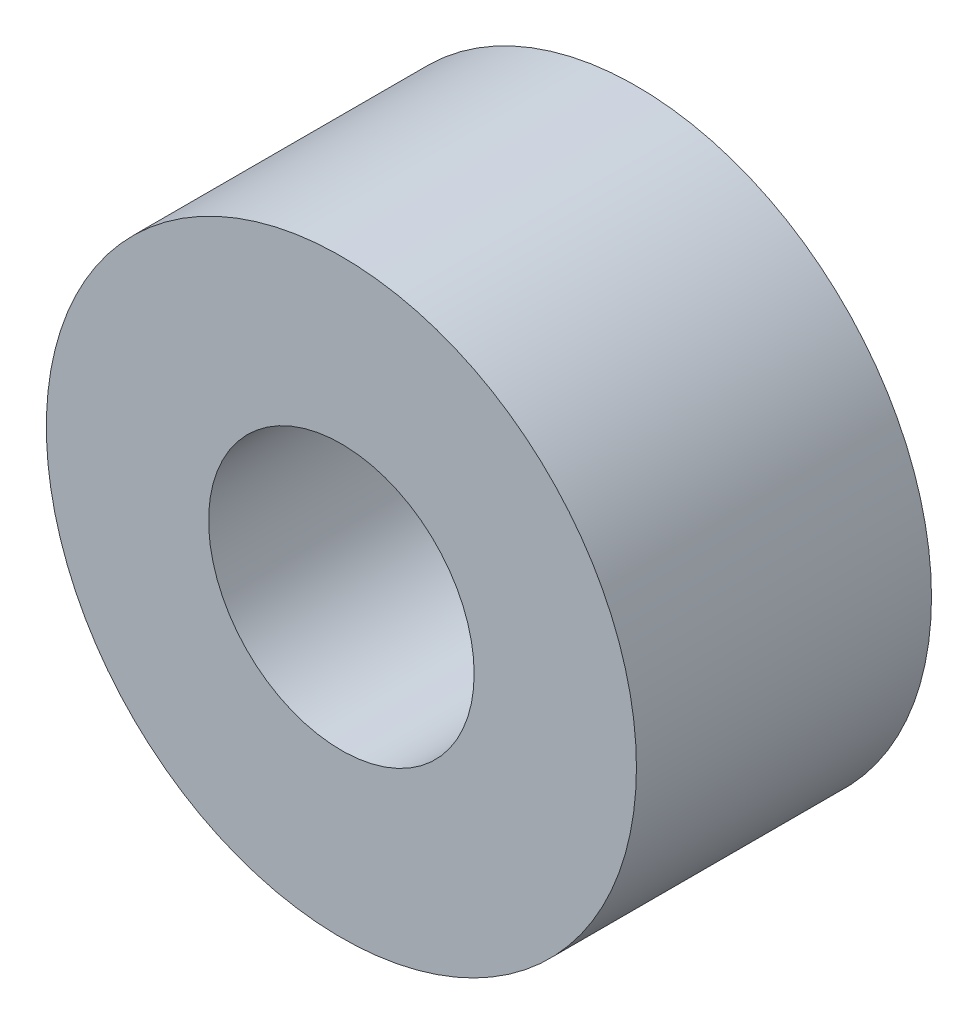
ISO-10303-21;
HEADER;
FILE_DESCRIPTION(('STEP AP214'),'2;1');
FILE_NAME('part.step','',(''),(''),'','','');
FILE_SCHEMA(('AUTOMOTIVE_DESIGN { 1 0 10303 214 1 1 1 1 }'));
ENDSEC;
DATA;
#1=APPLICATION_CONTEXT('core data for automotive mechanical design processes');
#2=APPLICATION_PROTOCOL_DEFINITION('international standard','automotive_design',2000,#1);
#3=PRODUCT_CONTEXT('',#1,'mechanical');
#4=PRODUCT('Part','Part','',(#3));
#5=PRODUCT_RELATED_PRODUCT_CATEGORY('part','',(#4));
#6=PRODUCT_DEFINITION_FORMATION('','',#4);
#7=PRODUCT_DEFINITION_CONTEXT('part definition',#1,'design');
#8=PRODUCT_DEFINITION('design','',#6,#7);
#9=PRODUCT_DEFINITION_SHAPE('','',#8);
#10=(LENGTH_UNIT() NAMED_UNIT(*) SI_UNIT(.MILLI.,.METRE.));
#11=(NAMED_UNIT(*) PLANE_ANGLE_UNIT() SI_UNIT($,.RADIAN.));
#12=(NAMED_UNIT(*) SI_UNIT($,.STERADIAN.) SOLID_ANGLE_UNIT());
#13=UNCERTAINTY_MEASURE_WITH_UNIT(LENGTH_MEASURE(1.E-05),#10,'distance_accuracy_value','');
#14=(GEOMETRIC_REPRESENTATION_CONTEXT(3) GLOBAL_UNCERTAINTY_ASSIGNED_CONTEXT((#13)) GLOBAL_UNIT_ASSIGNED_CONTEXT((#10,
#11,#12)) REPRESENTATION_CONTEXT('',''));
#15=CARTESIAN_POINT('',(0.,0.,0.));
#16=DIRECTION('',(0.,0.,1.));
#17=DIRECTION('',(1.,0.,0.));
#18=AXIS2_PLACEMENT_3D('',#15,#16,#17);
#19=CARTESIAN_POINT('',(0.,0.,0.));
#20=DIRECTION('',(0.,0.,1.));
#21=DIRECTION('',(1.,0.,0.));
#22=AXIS2_PLACEMENT_3D('',#19,#20,#21);
#23=CYLINDRICAL_SURFACE('',#22,2.7);
#24=CARTESIAN_POINT('',(0.,0.,3.));
#25=DIRECTION('',(0.,0.,1.));
#26=DIRECTION('',(1.,0.,0.));
#27=AXIS2_PLACEMENT_3D('',#24,#25,#26);
#28=CIRCLE('',#27,2.7);
#29=CARTESIAN_POINT('',(2.7,0.,3.));
#30=VERTEX_POINT('',#29);
#31=EDGE_CURVE('E25',#30,#30,#28,.T.);
#32=ORIENTED_EDGE('',*,*,#31,.T.);
#33=EDGE_LOOP('',(#32));
#34=FACE_BOUND('',#33,.T.);
#35=CARTESIAN_POINT('',(0.,0.,-3.));
#36=DIRECTION('',(0.,0.,1.));
#37=DIRECTION('',(1.,0.,0.));
#38=AXIS2_PLACEMENT_3D('',#35,#36,#37);
#39=CIRCLE('',#38,2.7);
#40=CARTESIAN_POINT('',(2.7,0.,-3.));
#41=VERTEX_POINT('',#40);
#42=EDGE_CURVE('E16',#41,#41,#39,.T.);
#43=ORIENTED_EDGE('',*,*,#42,.F.);
#44=EDGE_LOOP('',(#43));
#45=FACE_BOUND('',#44,.T.);
#46=ADVANCED_FACE('F13',(#34,#45),#23,.F.);
#47=CARTESIAN_POINT('',(0.,0.,-3.));
#48=DIRECTION('',(0.,0.,-1.));
#49=DIRECTION('',(-1.,0.,0.));
#50=AXIS2_PLACEMENT_3D('',#47,#48,#49);
#51=PLANE('',#50);
#52=ORIENTED_EDGE('',*,*,#42,.T.);
#53=EDGE_LOOP('',(#52));
#54=FACE_BOUND('',#53,.T.);
#55=CARTESIAN_POINT('',(0.,0.,-3.));
#56=DIRECTION('',(0.,0.,1.));
#57=DIRECTION('',(1.,0.,0.));
#58=AXIS2_PLACEMENT_3D('',#55,#56,#57);
#59=CIRCLE('',#58,6.);
#60=CARTESIAN_POINT('',(6.,0.,-3.));
#61=VERTEX_POINT('',#60);
#62=EDGE_CURVE('E20',#61,#61,#59,.T.);
#63=ORIENTED_EDGE('',*,*,#62,.F.);
#64=EDGE_LOOP('',(#63));
#65=FACE_BOUND('',#64,.T.);
#66=ADVANCED_FACE('F33',(#54,#65),#51,.T.);
#67=CARTESIAN_POINT('',(0.,0.,3.));
#68=DIRECTION('',(0.,0.,-1.));
#69=DIRECTION('',(-1.,0.,0.));
#70=AXIS2_PLACEMENT_3D('',#67,#68,#69);
#71=PLANE('',#70);
#72=ORIENTED_EDGE('',*,*,#31,.F.);
#73=EDGE_LOOP('',(#72));
#74=FACE_BOUND('',#73,.T.);
#75=CARTESIAN_POINT('',(0.,0.,3.));
#76=DIRECTION('',(0.,0.,1.));
#77=DIRECTION('',(1.,0.,0.));
#78=AXIS2_PLACEMENT_3D('',#75,#76,#77);
#79=CIRCLE('',#78,6.);
#80=CARTESIAN_POINT('',(6.,0.,3.));
#81=VERTEX_POINT('',#80);
#82=EDGE_CURVE('E8',#81,#81,#79,.F.);
#83=ORIENTED_EDGE('',*,*,#82,.F.);
#84=EDGE_LOOP('',(#83));
#85=FACE_BOUND('',#84,.T.);
#86=ADVANCED_FACE('F41',(#74,#85),#71,.F.);
#87=CARTESIAN_POINT('',(0.,0.,0.));
#88=DIRECTION('',(0.,0.,1.));
#89=DIRECTION('',(1.,0.,0.));
#90=AXIS2_PLACEMENT_3D('',#87,#88,#89);
#91=CYLINDRICAL_SURFACE('',#90,6.);
#92=ORIENTED_EDGE('',*,*,#82,.T.);
#93=EDGE_LOOP('',(#92));
#94=FACE_BOUND('',#93,.T.);
#95=ORIENTED_EDGE('',*,*,#62,.T.);
#96=EDGE_LOOP('',(#95));
#97=FACE_BOUND('',#96,.T.);
#98=ADVANCED_FACE('F42',(#94,#97),#91,.T.);
#99=CLOSED_SHELL('',(#46,#66,#86,#98));
#100=MANIFOLD_SOLID_BREP('B1',#99);
#101=ADVANCED_BREP_SHAPE_REPRESENTATION('',(#18,#100),#14);
#102=SHAPE_DEFINITION_REPRESENTATION(#9,#101);
ENDSEC;
END-ISO-10303-21;
